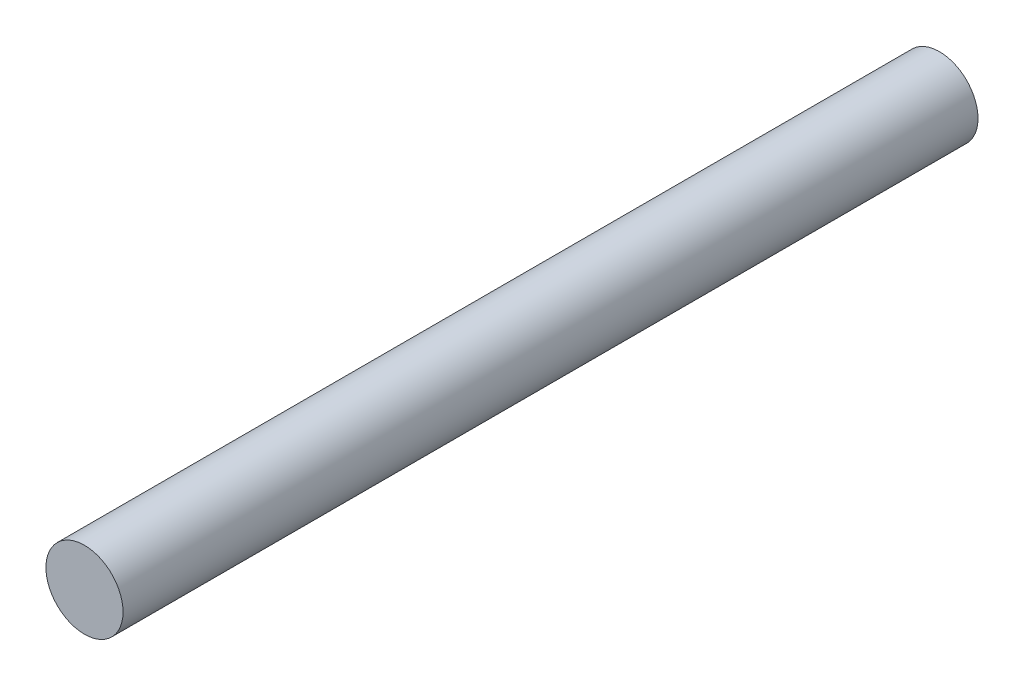
ISO-10303-21;
HEADER;
FILE_DESCRIPTION(('STEP AP214'),'2;1');
FILE_NAME('part.step','',(''),(''),'','','');
FILE_SCHEMA(('AUTOMOTIVE_DESIGN { 1 0 10303 214 1 1 1 1 }'));
ENDSEC;
DATA;
#1=APPLICATION_CONTEXT('core data for automotive mechanical design processes');
#2=APPLICATION_PROTOCOL_DEFINITION('international standard','automotive_design',2000,#1);
#3=PRODUCT_CONTEXT('',#1,'mechanical');
#4=PRODUCT('Part','Part','',(#3));
#5=PRODUCT_RELATED_PRODUCT_CATEGORY('part','',(#4));
#6=PRODUCT_DEFINITION_FORMATION('','',#4);
#7=PRODUCT_DEFINITION_CONTEXT('part definition',#1,'design');
#8=PRODUCT_DEFINITION('design','',#6,#7);
#9=PRODUCT_DEFINITION_SHAPE('','',#8);
#10=(LENGTH_UNIT() NAMED_UNIT(*) SI_UNIT(.MILLI.,.METRE.));
#11=(NAMED_UNIT(*) PLANE_ANGLE_UNIT() SI_UNIT($,.RADIAN.));
#12=(NAMED_UNIT(*) SI_UNIT($,.STERADIAN.) SOLID_ANGLE_UNIT());
#13=UNCERTAINTY_MEASURE_WITH_UNIT(LENGTH_MEASURE(1.E-05),#10,'distance_accuracy_value','');
#14=(GEOMETRIC_REPRESENTATION_CONTEXT(3) GLOBAL_UNCERTAINTY_ASSIGNED_CONTEXT((#13)) GLOBAL_UNIT_ASSIGNED_CONTEXT((#10,
#11,#12)) REPRESENTATION_CONTEXT('',''));
#15=CARTESIAN_POINT('',(0.,0.,0.));
#16=DIRECTION('',(0.,0.,1.));
#17=DIRECTION('',(1.,0.,0.));
#18=AXIS2_PLACEMENT_3D('',#15,#16,#17);
#19=CARTESIAN_POINT('',(0.,0.,70.399999916));
#20=DIRECTION('',(0.,0.,-1.));
#21=DIRECTION('',(-1.,0.,0.));
#22=AXIS2_PLACEMENT_3D('',#19,#20,#21);
#23=CYLINDRICAL_SURFACE('',#22,3.175);
#24=CARTESIAN_POINT('',(0.,0.,70.399999916));
#25=DIRECTION('',(0.,0.,1.));
#26=DIRECTION('',(1.,0.,0.));
#27=AXIS2_PLACEMENT_3D('',#24,#25,#26);
#28=CIRCLE('',#27,3.175);
#29=CARTESIAN_POINT('',(3.175,0.,70.399999916));
#30=VERTEX_POINT('',#29);
#31=EDGE_CURVE('E10',#30,#30,#28,.T.);
#32=ORIENTED_EDGE('',*,*,#31,.F.);
#33=EDGE_LOOP('',(#32));
#34=FACE_BOUND('',#33,.T.);
#35=CARTESIAN_POINT('',(0.,0.,0.));
#36=DIRECTION('',(0.,0.,1.));
#37=DIRECTION('',(1.,0.,0.));
#38=AXIS2_PLACEMENT_3D('',#35,#36,#37);
#39=CIRCLE('',#38,3.175);
#40=CARTESIAN_POINT('',(3.175,0.,0.));
#41=VERTEX_POINT('',#40);
#42=EDGE_CURVE('E18',#41,#41,#39,.T.);
#43=ORIENTED_EDGE('',*,*,#42,.T.);
#44=EDGE_LOOP('',(#43));
#45=FACE_BOUND('',#44,.T.);
#46=ADVANCED_FACE('F15',(#34,#45),#23,.T.);
#47=CARTESIAN_POINT('',(0.,0.,70.399999916));
#48=DIRECTION('',(0.,0.,1.));
#49=DIRECTION('',(1.,0.,0.));
#50=AXIS2_PLACEMENT_3D('',#47,#48,#49);
#51=PLANE('',#50);
#52=ORIENTED_EDGE('',*,*,#31,.T.);
#53=EDGE_LOOP('',(#52));
#54=FACE_BOUND('',#53,.T.);
#55=ADVANCED_FACE('F39',(#54),#51,.T.);
#56=CARTESIAN_POINT('',(0.,0.,0.));
#57=DIRECTION('',(0.,0.,1.));
#58=DIRECTION('',(1.,0.,0.));
#59=AXIS2_PLACEMENT_3D('',#56,#57,#58);
#60=PLANE('',#59);
#61=ORIENTED_EDGE('',*,*,#42,.F.);
#62=EDGE_LOOP('',(#61));
#63=FACE_BOUND('',#62,.T.);
#64=ADVANCED_FACE('F37',(#63),#60,.F.);
#65=CLOSED_SHELL('',(#46,#55,#64));
#66=MANIFOLD_SOLID_BREP('B1',#65);
#67=ADVANCED_BREP_SHAPE_REPRESENTATION('',(#18,#66),#14);
#68=SHAPE_DEFINITION_REPRESENTATION(#9,#67);
ENDSEC;
END-ISO-10303-21;
